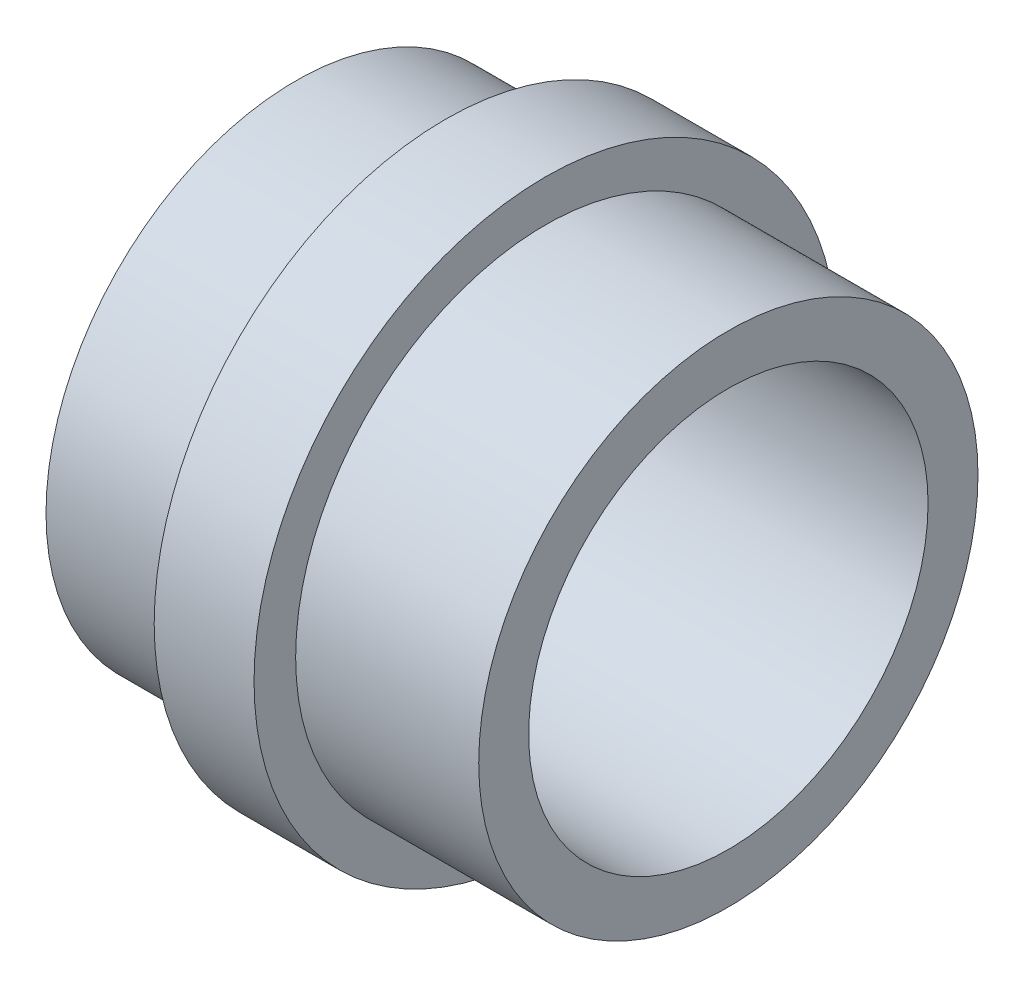
ISO-10303-21;
HEADER;
FILE_DESCRIPTION(('STEP AP214'),'2;1');
FILE_NAME('part.step','',(''),(''),'','','');
FILE_SCHEMA(('AUTOMOTIVE_DESIGN { 1 0 10303 214 1 1 1 1 }'));
ENDSEC;
DATA;
#1=APPLICATION_CONTEXT('core data for automotive mechanical design processes');
#2=APPLICATION_PROTOCOL_DEFINITION('international standard','automotive_design',2000,#1);
#3=PRODUCT_CONTEXT('',#1,'mechanical');
#4=PRODUCT('Part','Part','',(#3));
#5=PRODUCT_RELATED_PRODUCT_CATEGORY('part','',(#4));
#6=PRODUCT_DEFINITION_FORMATION('','',#4);
#7=PRODUCT_DEFINITION_CONTEXT('part definition',#1,'design');
#8=PRODUCT_DEFINITION('design','',#6,#7);
#9=PRODUCT_DEFINITION_SHAPE('','',#8);
#10=(LENGTH_UNIT() NAMED_UNIT(*) SI_UNIT(.MILLI.,.METRE.));
#11=(NAMED_UNIT(*) PLANE_ANGLE_UNIT() SI_UNIT($,.RADIAN.));
#12=(NAMED_UNIT(*) SI_UNIT($,.STERADIAN.) SOLID_ANGLE_UNIT());
#13=UNCERTAINTY_MEASURE_WITH_UNIT(LENGTH_MEASURE(1.E-05),#10,'distance_accuracy_value','');
#14=(GEOMETRIC_REPRESENTATION_CONTEXT(3) GLOBAL_UNCERTAINTY_ASSIGNED_CONTEXT((#13)) GLOBAL_UNIT_ASSIGNED_CONTEXT((#10,
#11,#12)) REPRESENTATION_CONTEXT('',''));
#15=CARTESIAN_POINT('',(0.,0.,0.));
#16=DIRECTION('',(0.,0.,1.));
#17=DIRECTION('',(1.,0.,0.));
#18=AXIS2_PLACEMENT_3D('',#15,#16,#17);
#19=CARTESIAN_POINT('',(26.,0.,0.));
#20=DIRECTION('',(1.,0.,0.));
#21=DIRECTION('',(0.,0.,-1.));
#22=AXIS2_PLACEMENT_3D('',#19,#20,#21);
#23=CYLINDRICAL_SURFACE('',#22,15.);
#24=CARTESIAN_POINT('',(0.,0.,0.));
#25=DIRECTION('',(1.,0.,0.));
#26=DIRECTION('',(0.,0.,-1.));
#27=AXIS2_PLACEMENT_3D('',#24,#25,#26);
#28=CIRCLE('',#27,15.);
#29=CARTESIAN_POINT('',(0.,0.,-15.));
#30=VERTEX_POINT('',#29);
#31=EDGE_CURVE('E5',#30,#30,#28,.T.);
#32=ORIENTED_EDGE('',*,*,#31,.T.);
#33=EDGE_LOOP('',(#32));
#34=FACE_BOUND('',#33,.T.);
#35=CARTESIAN_POINT('',(9.,0.,0.));
#36=DIRECTION('',(1.,0.,0.));
#37=DIRECTION('',(0.,0.,-1.));
#38=AXIS2_PLACEMENT_3D('',#35,#36,#37);
#39=CIRCLE('',#38,15.);
#40=CARTESIAN_POINT('',(9.,0.,-15.));
#41=VERTEX_POINT('',#40);
#42=EDGE_CURVE('E9',#41,#41,#39,.T.);
#43=ORIENTED_EDGE('',*,*,#42,.F.);
#44=EDGE_LOOP('',(#43));
#45=FACE_BOUND('',#44,.T.);
#46=ADVANCED_FACE('F13',(#34,#45),#23,.T.);
#47=CARTESIAN_POINT('',(0.,15.,0.));
#48=DIRECTION('',(-1.,0.,0.));
#49=DIRECTION('',(0.,0.,1.));
#50=AXIS2_PLACEMENT_3D('',#47,#48,#49);
#51=PLANE('',#50);
#52=CARTESIAN_POINT('',(0.,0.,0.));
#53=DIRECTION('',(1.,0.,0.));
#54=DIRECTION('',(0.,0.,-1.));
#55=AXIS2_PLACEMENT_3D('',#52,#53,#54);
#56=CIRCLE('',#55,12.);
#57=CARTESIAN_POINT('',(0.,0.,-12.));
#58=VERTEX_POINT('',#57);
#59=EDGE_CURVE('E24',#58,#58,#56,.T.);
#60=ORIENTED_EDGE('',*,*,#59,.T.);
#61=EDGE_LOOP('',(#60));
#62=FACE_BOUND('',#61,.T.);
#63=ORIENTED_EDGE('',*,*,#31,.F.);
#64=EDGE_LOOP('',(#63));
#65=FACE_BOUND('',#64,.T.);
#66=ADVANCED_FACE('F30',(#62,#65),#51,.T.);
#67=CARTESIAN_POINT('',(9.,17.5,0.));
#68=DIRECTION('',(-1.,0.,0.));
#69=DIRECTION('',(0.,0.,1.));
#70=AXIS2_PLACEMENT_3D('',#67,#68,#69);
#71=PLANE('',#70);
#72=ORIENTED_EDGE('',*,*,#42,.T.);
#73=EDGE_LOOP('',(#72));
#74=FACE_BOUND('',#73,.T.);
#75=CARTESIAN_POINT('',(9.,0.,0.));
#76=DIRECTION('',(1.,0.,0.));
#77=DIRECTION('',(0.,0.,-1.));
#78=AXIS2_PLACEMENT_3D('',#75,#76,#77);
#79=CIRCLE('',#78,17.5);
#80=CARTESIAN_POINT('',(9.,0.,-17.5));
#81=VERTEX_POINT('',#80);
#82=EDGE_CURVE('E39',#81,#81,#79,.T.);
#83=ORIENTED_EDGE('',*,*,#82,.F.);
#84=EDGE_LOOP('',(#83));
#85=FACE_BOUND('',#84,.T.);
#86=ADVANCED_FACE('F43',(#74,#85),#71,.T.);
#87=CARTESIAN_POINT('',(26.,0.,0.));
#88=DIRECTION('',(1.,0.,0.));
#89=DIRECTION('',(0.,0.,-1.));
#90=AXIS2_PLACEMENT_3D('',#87,#88,#89);
#91=CYLINDRICAL_SURFACE('',#90,12.);
#92=CARTESIAN_POINT('',(26.,0.,0.));
#93=DIRECTION('',(1.,0.,0.));
#94=DIRECTION('',(0.,0.,-1.));
#95=AXIS2_PLACEMENT_3D('',#92,#93,#94);
#96=CIRCLE('',#95,12.);
#97=CARTESIAN_POINT('',(26.,0.,-12.));
#98=VERTEX_POINT('',#97);
#99=EDGE_CURVE('E50',#98,#98,#96,.T.);
#100=ORIENTED_EDGE('',*,*,#99,.T.);
#101=EDGE_LOOP('',(#100));
#102=FACE_BOUND('',#101,.T.);
#103=ORIENTED_EDGE('',*,*,#59,.F.);
#104=EDGE_LOOP('',(#103));
#105=FACE_BOUND('',#104,.T.);
#106=ADVANCED_FACE('F56',(#102,#105),#91,.F.);
#107=CARTESIAN_POINT('',(26.,0.,0.));
#108=DIRECTION('',(1.,0.,0.));
#109=DIRECTION('',(0.,0.,-1.));
#110=AXIS2_PLACEMENT_3D('',#107,#108,#109);
#111=CYLINDRICAL_SURFACE('',#110,17.5);
#112=ORIENTED_EDGE('',*,*,#82,.T.);
#113=EDGE_LOOP('',(#112));
#114=FACE_BOUND('',#113,.T.);
#115=CARTESIAN_POINT('',(15.,0.,0.));
#116=DIRECTION('',(1.,0.,0.));
#117=DIRECTION('',(0.,0.,-1.));
#118=AXIS2_PLACEMENT_3D('',#115,#116,#117);
#119=CIRCLE('',#118,17.5);
#120=CARTESIAN_POINT('',(15.,0.,-17.5));
#121=VERTEX_POINT('',#120);
#122=EDGE_CURVE('E65',#121,#121,#119,.T.);
#123=ORIENTED_EDGE('',*,*,#122,.F.);
#124=EDGE_LOOP('',(#123));
#125=FACE_BOUND('',#124,.T.);
#126=ADVANCED_FACE('F69',(#114,#125),#111,.T.);
#127=CARTESIAN_POINT('',(26.,12.,0.));
#128=DIRECTION('',(1.,0.,0.));
#129=DIRECTION('',(0.,0.,-1.));
#130=AXIS2_PLACEMENT_3D('',#127,#128,#129);
#131=PLANE('',#130);
#132=CARTESIAN_POINT('',(26.,0.,0.));
#133=DIRECTION('',(1.,0.,0.));
#134=DIRECTION('',(0.,0.,-1.));
#135=AXIS2_PLACEMENT_3D('',#132,#133,#134);
#136=CIRCLE('',#135,15.);
#137=CARTESIAN_POINT('',(26.,0.,-15.));
#138=VERTEX_POINT('',#137);
#139=EDGE_CURVE('E76',#138,#138,#136,.T.);
#140=ORIENTED_EDGE('',*,*,#139,.T.);
#141=EDGE_LOOP('',(#140));
#142=FACE_BOUND('',#141,.T.);
#143=ORIENTED_EDGE('',*,*,#99,.F.);
#144=EDGE_LOOP('',(#143));
#145=FACE_BOUND('',#144,.T.);
#146=ADVANCED_FACE('F82',(#142,#145),#131,.T.);
#147=CARTESIAN_POINT('',(15.,15.,0.));
#148=DIRECTION('',(1.,0.,0.));
#149=DIRECTION('',(0.,0.,-1.));
#150=AXIS2_PLACEMENT_3D('',#147,#148,#149);
#151=PLANE('',#150);
#152=ORIENTED_EDGE('',*,*,#122,.T.);
#153=EDGE_LOOP('',(#152));
#154=FACE_BOUND('',#153,.T.);
#155=CARTESIAN_POINT('',(15.,0.,0.));
#156=DIRECTION('',(1.,0.,0.));
#157=DIRECTION('',(0.,0.,-1.));
#158=AXIS2_PLACEMENT_3D('',#155,#156,#157);
#159=CIRCLE('',#158,15.);
#160=CARTESIAN_POINT('',(15.,0.,-15.));
#161=VERTEX_POINT('',#160);
#162=EDGE_CURVE('E91',#161,#161,#159,.T.);
#163=ORIENTED_EDGE('',*,*,#162,.F.);
#164=EDGE_LOOP('',(#163));
#165=FACE_BOUND('',#164,.T.);
#166=ADVANCED_FACE('F95',(#154,#165),#151,.T.);
#167=CARTESIAN_POINT('',(26.,0.,0.));
#168=DIRECTION('',(1.,0.,0.));
#169=DIRECTION('',(0.,0.,-1.));
#170=AXIS2_PLACEMENT_3D('',#167,#168,#169);
#171=CYLINDRICAL_SURFACE('',#170,15.);
#172=ORIENTED_EDGE('',*,*,#162,.T.);
#173=EDGE_LOOP('',(#172));
#174=FACE_BOUND('',#173,.T.);
#175=ORIENTED_EDGE('',*,*,#139,.F.);
#176=EDGE_LOOP('',(#175));
#177=FACE_BOUND('',#176,.T.);
#178=ADVANCED_FACE('F106',(#174,#177),#171,.T.);
#179=CLOSED_SHELL('',(#46,#66,#86,#106,#126,#146,#166,#178));
#180=MANIFOLD_SOLID_BREP('B1',#179);
#181=ADVANCED_BREP_SHAPE_REPRESENTATION('',(#18,#180),#14);
#182=SHAPE_DEFINITION_REPRESENTATION(#9,#181);
ENDSEC;
END-ISO-10303-21;
